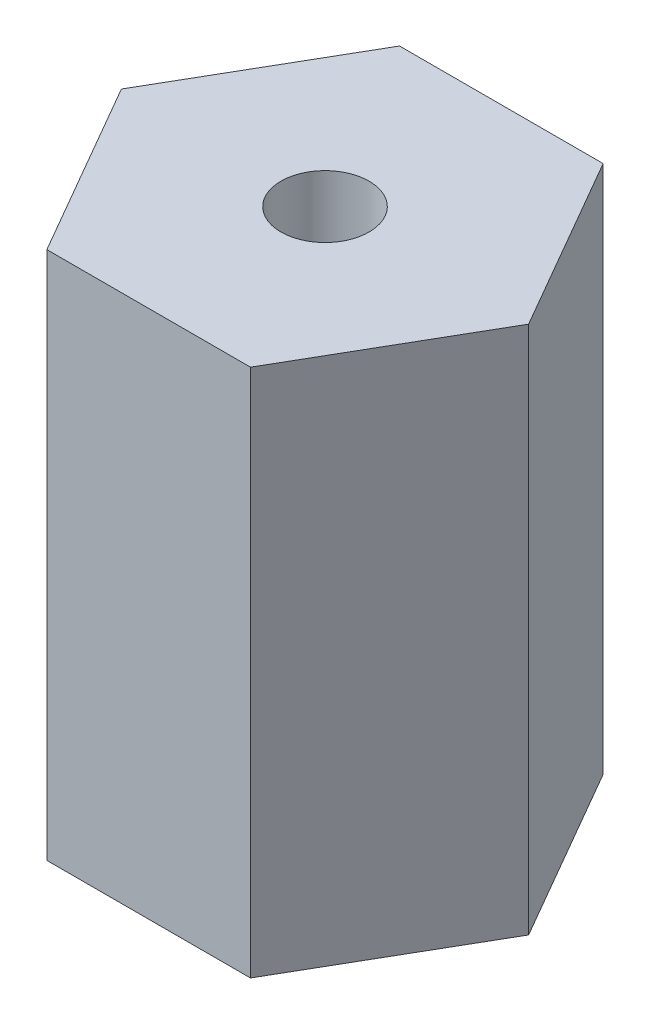
ISO-10303-21;
HEADER;
FILE_DESCRIPTION(('STEP AP214'),'2;1');
FILE_NAME('part.step','',(''),(''),'','','');
FILE_SCHEMA(('AUTOMOTIVE_DESIGN { 1 0 10303 214 1 1 1 1 }'));
ENDSEC;
DATA;
#1=APPLICATION_CONTEXT('core data for automotive mechanical design processes');
#2=APPLICATION_PROTOCOL_DEFINITION('international standard','automotive_design',2000,#1);
#3=PRODUCT_CONTEXT('',#1,'mechanical');
#4=PRODUCT('Part','Part','',(#3));
#5=PRODUCT_RELATED_PRODUCT_CATEGORY('part','',(#4));
#6=PRODUCT_DEFINITION_FORMATION('','',#4);
#7=PRODUCT_DEFINITION_CONTEXT('part definition',#1,'design');
#8=PRODUCT_DEFINITION('design','',#6,#7);
#9=PRODUCT_DEFINITION_SHAPE('','',#8);
#10=(LENGTH_UNIT() NAMED_UNIT(*) SI_UNIT(.MILLI.,.METRE.));
#11=(NAMED_UNIT(*) PLANE_ANGLE_UNIT() SI_UNIT($,.RADIAN.));
#12=(NAMED_UNIT(*) SI_UNIT($,.STERADIAN.) SOLID_ANGLE_UNIT());
#13=UNCERTAINTY_MEASURE_WITH_UNIT(LENGTH_MEASURE(1.E-05),#10,'distance_accuracy_value','');
#14=(GEOMETRIC_REPRESENTATION_CONTEXT(3) GLOBAL_UNCERTAINTY_ASSIGNED_CONTEXT((#13)) GLOBAL_UNIT_ASSIGNED_CONTEXT((#10,
#11,#12)) REPRESENTATION_CONTEXT('',''));
#15=CARTESIAN_POINT('',(0.,0.,0.));
#16=DIRECTION('',(0.,0.,1.));
#17=DIRECTION('',(1.,0.,0.));
#18=AXIS2_PLACEMENT_3D('',#15,#16,#17);
#19=CARTESIAN_POINT('',(0.,30.,0.));
#20=DIRECTION('',(0.,1.,0.));
#21=DIRECTION('',(0.,0.,1.));
#22=AXIS2_PLACEMENT_3D('',#19,#20,#21);
#23=PLANE('',#22);
#24=DIRECTION('',(0.5,0.,-0.866025403784439));
#25=VECTOR('',#24,1.);
#26=CARTESIAN_POINT('',(-9.13675134594814,30.,4.17468245269454));
#27=LINE('',#26,#25);
#28=CARTESIAN_POINT('',(-9.13675134594814,30.,4.17468245269454));
#29=VERTEX_POINT('',#28);
#30=CARTESIAN_POINT('',(-3.36324865405187,30.,-5.82531754730549));
#31=VERTEX_POINT('',#30);
#32=EDGE_CURVE('E129',#29,#31,#27,.T.);
#33=ORIENTED_EDGE('',*,*,#32,.T.);
#34=DIRECTION('',(-0.5,0.,-0.866025403784439));
#35=VECTOR('',#34,1.);
#36=CARTESIAN_POINT('',(-3.36324865405187,30.,-5.82531754730549));
#37=LINE('',#36,#35);
#38=CARTESIAN_POINT('',(-9.13675134594814,30.,-15.8253175473055));
#39=VERTEX_POINT('',#38);
#40=EDGE_CURVE('E87',#31,#39,#37,.T.);
#41=ORIENTED_EDGE('',*,*,#40,.T.);
#42=DIRECTION('',(-1.,0.,0.));
#43=VECTOR('',#42,1.);
#44=CARTESIAN_POINT('',(-9.13675134594814,30.,-15.8253175473055));
#45=LINE('',#44,#43);
#46=CARTESIAN_POINT('',(-20.6837567297407,30.,-15.8253175473055));
#47=VERTEX_POINT('',#46);
#48=EDGE_CURVE('E100',#39,#47,#45,.T.);
#49=ORIENTED_EDGE('',*,*,#48,.T.);
#50=DIRECTION('',(-0.5,0.,0.866025403784439));
#51=VECTOR('',#50,1.);
#52=CARTESIAN_POINT('',(-20.6837567297407,30.,-15.8253175473055));
#53=LINE('',#52,#51);
#54=CARTESIAN_POINT('',(-26.4572594216369,30.,-5.82531754730548));
#55=VERTEX_POINT('',#54);
#56=EDGE_CURVE('E94',#47,#55,#53,.T.);
#57=ORIENTED_EDGE('',*,*,#56,.T.);
#58=DIRECTION('',(0.5,0.,0.866025403784439));
#59=VECTOR('',#58,1.);
#60=CARTESIAN_POINT('',(-26.4572594216369,30.,-5.82531754730548));
#61=LINE('',#60,#59);
#62=CARTESIAN_POINT('',(-20.6837567297407,30.,4.17468245269454));
#63=VERTEX_POINT('',#62);
#64=EDGE_CURVE('E98',#55,#63,#61,.T.);
#65=ORIENTED_EDGE('',*,*,#64,.T.);
#66=DIRECTION('',(1.,0.,0.));
#67=VECTOR('',#66,1.);
#68=CARTESIAN_POINT('',(-20.6837567297407,30.,4.17468245269454));
#69=LINE('',#68,#67);
#70=EDGE_CURVE('E50',#63,#29,#69,.T.);
#71=ORIENTED_EDGE('',*,*,#70,.T.);
#72=EDGE_LOOP('',(#33,#41,#49,#57,#65,#71));
#73=FACE_BOUND('',#72,.T.);
#74=CARTESIAN_POINT('',(-14.9102540378444,30.,-5.82531754730548));
#75=DIRECTION('',(0.,1.,0.));
#76=DIRECTION('',(0.,0.,1.));
#77=AXIS2_PLACEMENT_3D('',#74,#75,#76);
#78=CIRCLE('',#77,2.5);
#79=CARTESIAN_POINT('',(-14.9102540378444,30.,-3.32531754730548));
#80=VERTEX_POINT('',#79);
#81=EDGE_CURVE('E122',#80,#80,#78,.T.);
#82=ORIENTED_EDGE('',*,*,#81,.F.);
#83=EDGE_LOOP('',(#82));
#84=FACE_BOUND('',#83,.T.);
#85=ADVANCED_FACE('F33',(#73,#84),#23,.T.);
#86=CARTESIAN_POINT('',(0.,0.,0.));
#87=DIRECTION('',(0.,1.,0.));
#88=DIRECTION('',(0.,0.,1.));
#89=AXIS2_PLACEMENT_3D('',#86,#87,#88);
#90=PLANE('',#89);
#91=DIRECTION('',(0.5,0.,-0.866025403784439));
#92=VECTOR('',#91,1.);
#93=CARTESIAN_POINT('',(-9.13675134594814,0.,4.17468245269454));
#94=LINE('',#93,#92);
#95=CARTESIAN_POINT('',(-9.13675134594814,0.,4.17468245269454));
#96=VERTEX_POINT('',#95);
#97=CARTESIAN_POINT('',(-3.36324865405187,0.,-5.82531754730549));
#98=VERTEX_POINT('',#97);
#99=EDGE_CURVE('E118',#96,#98,#94,.T.);
#100=ORIENTED_EDGE('',*,*,#99,.F.);
#101=DIRECTION('',(1.,0.,0.));
#102=VECTOR('',#101,1.);
#103=CARTESIAN_POINT('',(-20.6837567297407,0.,4.17468245269454));
#104=LINE('',#103,#102);
#105=CARTESIAN_POINT('',(-20.6837567297407,0.,4.17468245269454));
#106=VERTEX_POINT('',#105);
#107=EDGE_CURVE('E79',#106,#96,#104,.T.);
#108=ORIENTED_EDGE('',*,*,#107,.F.);
#109=DIRECTION('',(0.5,0.,0.866025403784439));
#110=VECTOR('',#109,1.);
#111=CARTESIAN_POINT('',(-26.4572594216369,0.,-5.82531754730548));
#112=LINE('',#111,#110);
#113=CARTESIAN_POINT('',(-26.4572594216369,0.,-5.82531754730548));
#114=VERTEX_POINT('',#113);
#115=EDGE_CURVE('E73',#114,#106,#112,.T.);
#116=ORIENTED_EDGE('',*,*,#115,.F.);
#117=DIRECTION('',(-0.5,0.,0.866025403784439));
#118=VECTOR('',#117,1.);
#119=CARTESIAN_POINT('',(-20.6837567297407,0.,-15.8253175473055));
#120=LINE('',#119,#118);
#121=CARTESIAN_POINT('',(-20.6837567297407,0.,-15.8253175473055));
#122=VERTEX_POINT('',#121);
#123=EDGE_CURVE('E108',#122,#114,#120,.T.);
#124=ORIENTED_EDGE('',*,*,#123,.F.);
#125=DIRECTION('',(-1.,0.,0.));
#126=VECTOR('',#125,1.);
#127=CARTESIAN_POINT('',(-9.13675134594814,0.,-15.8253175473055));
#128=LINE('',#127,#126);
#129=CARTESIAN_POINT('',(-9.13675134594814,0.,-15.8253175473055));
#130=VERTEX_POINT('',#129);
#131=EDGE_CURVE('E124',#130,#122,#128,.T.);
#132=ORIENTED_EDGE('',*,*,#131,.F.);
#133=DIRECTION('',(-0.5,0.,-0.866025403784439));
#134=VECTOR('',#133,1.);
#135=CARTESIAN_POINT('',(-3.36324865405187,0.,-5.82531754730549));
#136=LINE('',#135,#134);
#137=EDGE_CURVE('E121',#98,#130,#136,.T.);
#138=ORIENTED_EDGE('',*,*,#137,.F.);
#139=EDGE_LOOP('',(#100,#108,#116,#124,#132,#138));
#140=FACE_BOUND('',#139,.T.);
#141=CARTESIAN_POINT('',(-14.9102540378444,0.,-5.82531754730548));
#142=DIRECTION('',(0.,1.,0.));
#143=DIRECTION('',(0.,0.,1.));
#144=AXIS2_PLACEMENT_3D('',#141,#142,#143);
#145=CIRCLE('',#144,2.5);
#146=CARTESIAN_POINT('',(-14.9102540378444,0.,-3.32531754730548));
#147=VERTEX_POINT('',#146);
#148=EDGE_CURVE('E222',#147,#147,#145,.T.);
#149=ORIENTED_EDGE('',*,*,#148,.T.);
#150=EDGE_LOOP('',(#149));
#151=FACE_BOUND('',#150,.T.);
#152=ADVANCED_FACE('F138',(#140,#151),#90,.F.);
#153=CARTESIAN_POINT('',(-9.13675134594814,30.,4.17468245269454));
#154=DIRECTION('',(-0.866025403784439,0.,-0.5));
#155=DIRECTION('',(-0.5,0.,0.866025403784439));
#156=AXIS2_PLACEMENT_3D('',#153,#154,#155);
#157=PLANE('',#156);
#158=ORIENTED_EDGE('',*,*,#99,.T.);
#159=DIRECTION('',(0.,-1.,0.));
#160=VECTOR('',#159,1.);
#161=CARTESIAN_POINT('',(-3.36324865405187,30.,-5.82531754730549));
#162=LINE('',#161,#160);
#163=EDGE_CURVE('E11',#31,#98,#162,.T.);
#164=ORIENTED_EDGE('',*,*,#163,.F.);
#165=ORIENTED_EDGE('',*,*,#32,.F.);
#166=DIRECTION('',(0.,-1.,0.));
#167=VECTOR('',#166,1.);
#168=CARTESIAN_POINT('',(-9.13675134594814,30.,4.17468245269454));
#169=LINE('',#168,#167);
#170=EDGE_CURVE('E114',#29,#96,#169,.T.);
#171=ORIENTED_EDGE('',*,*,#170,.T.);
#172=EDGE_LOOP('',(#158,#164,#165,#171));
#173=FACE_BOUND('',#172,.T.);
#174=ADVANCED_FACE('F35',(#173),#157,.F.);
#175=CARTESIAN_POINT('',(-3.36324865405187,30.,-5.82531754730549));
#176=DIRECTION('',(-0.866025403784439,0.,0.5));
#177=DIRECTION('',(0.5,0.,0.866025403784439));
#178=AXIS2_PLACEMENT_3D('',#175,#176,#177);
#179=PLANE('',#178);
#180=ORIENTED_EDGE('',*,*,#137,.T.);
#181=DIRECTION('',(0.,-1.,0.));
#182=VECTOR('',#181,1.);
#183=CARTESIAN_POINT('',(-9.13675134594814,30.,-15.8253175473055));
#184=LINE('',#183,#182);
#185=EDGE_CURVE('E42',#39,#130,#184,.T.);
#186=ORIENTED_EDGE('',*,*,#185,.F.);
#187=ORIENTED_EDGE('',*,*,#40,.F.);
#188=ORIENTED_EDGE('',*,*,#163,.T.);
#189=EDGE_LOOP('',(#180,#186,#187,#188));
#190=FACE_BOUND('',#189,.T.);
#191=ADVANCED_FACE('F163',(#190),#179,.F.);
#192=CARTESIAN_POINT('',(-9.13675134594814,30.,-15.8253175473055));
#193=DIRECTION('',(0.,0.,1.));
#194=DIRECTION('',(1.,0.,0.));
#195=AXIS2_PLACEMENT_3D('',#192,#193,#194);
#196=PLANE('',#195);
#197=ORIENTED_EDGE('',*,*,#131,.T.);
#198=DIRECTION('',(0.,-1.,0.));
#199=VECTOR('',#198,1.);
#200=CARTESIAN_POINT('',(-20.6837567297407,30.,-15.8253175473055));
#201=LINE('',#200,#199);
#202=EDGE_CURVE('E109',#47,#122,#201,.T.);
#203=ORIENTED_EDGE('',*,*,#202,.F.);
#204=ORIENTED_EDGE('',*,*,#48,.F.);
#205=ORIENTED_EDGE('',*,*,#185,.T.);
#206=EDGE_LOOP('',(#197,#203,#204,#205));
#207=FACE_BOUND('',#206,.T.);
#208=ADVANCED_FACE('F135',(#207),#196,.F.);
#209=CARTESIAN_POINT('',(-20.6837567297407,30.,-15.8253175473055));
#210=DIRECTION('',(0.866025403784439,0.,0.5));
#211=DIRECTION('',(0.5,0.,-0.866025403784439));
#212=AXIS2_PLACEMENT_3D('',#209,#210,#211);
#213=PLANE('',#212);
#214=ORIENTED_EDGE('',*,*,#123,.T.);
#215=DIRECTION('',(0.,-1.,0.));
#216=VECTOR('',#215,1.);
#217=CARTESIAN_POINT('',(-26.4572594216369,30.,-5.82531754730548));
#218=LINE('',#217,#216);
#219=EDGE_CURVE('E105',#55,#114,#218,.T.);
#220=ORIENTED_EDGE('',*,*,#219,.F.);
#221=ORIENTED_EDGE('',*,*,#56,.F.);
#222=ORIENTED_EDGE('',*,*,#202,.T.);
#223=EDGE_LOOP('',(#214,#220,#221,#222));
#224=FACE_BOUND('',#223,.T.);
#225=ADVANCED_FACE('F106',(#224),#213,.F.);
#226=CARTESIAN_POINT('',(-26.4572594216369,30.,-5.82531754730548));
#227=DIRECTION('',(0.866025403784439,0.,-0.5));
#228=DIRECTION('',(-0.5,0.,-0.866025403784439));
#229=AXIS2_PLACEMENT_3D('',#226,#227,#228);
#230=PLANE('',#229);
#231=ORIENTED_EDGE('',*,*,#115,.T.);
#232=DIRECTION('',(0.,-1.,0.));
#233=VECTOR('',#232,1.);
#234=CARTESIAN_POINT('',(-20.6837567297407,30.,4.17468245269454));
#235=LINE('',#234,#233);
#236=EDGE_CURVE('E110',#63,#106,#235,.T.);
#237=ORIENTED_EDGE('',*,*,#236,.F.);
#238=ORIENTED_EDGE('',*,*,#64,.F.);
#239=ORIENTED_EDGE('',*,*,#219,.T.);
#240=EDGE_LOOP('',(#231,#237,#238,#239));
#241=FACE_BOUND('',#240,.T.);
#242=ADVANCED_FACE('F112',(#241),#230,.F.);
#243=CARTESIAN_POINT('',(-20.6837567297407,30.,4.17468245269454));
#244=DIRECTION('',(0.,0.,-1.));
#245=DIRECTION('',(-1.,0.,0.));
#246=AXIS2_PLACEMENT_3D('',#243,#244,#245);
#247=PLANE('',#246);
#248=ORIENTED_EDGE('',*,*,#107,.T.);
#249=ORIENTED_EDGE('',*,*,#170,.F.);
#250=ORIENTED_EDGE('',*,*,#70,.F.);
#251=ORIENTED_EDGE('',*,*,#236,.T.);
#252=EDGE_LOOP('',(#248,#249,#250,#251));
#253=FACE_BOUND('',#252,.T.);
#254=ADVANCED_FACE('F143',(#253),#247,.F.);
#255=CARTESIAN_POINT('',(-14.9102540378444,30.,-5.82531754730548));
#256=DIRECTION('',(0.,-1.,0.));
#257=DIRECTION('',(0.,0.,-1.));
#258=AXIS2_PLACEMENT_3D('',#255,#256,#257);
#259=CYLINDRICAL_SURFACE('',#258,2.5);
#260=ORIENTED_EDGE('',*,*,#81,.T.);
#261=EDGE_LOOP('',(#260));
#262=FACE_BOUND('',#261,.T.);
#263=ORIENTED_EDGE('',*,*,#148,.F.);
#264=EDGE_LOOP('',(#263));
#265=FACE_BOUND('',#264,.T.);
#266=ADVANCED_FACE('F145',(#262,#265),#259,.F.);
#267=CLOSED_SHELL('',(#85,#152,#174,#191,#208,#225,#242,#254,#266));
#268=MANIFOLD_SOLID_BREP('B2',#267);
#269=ADVANCED_BREP_SHAPE_REPRESENTATION('',(#18,#268),#14);
#270=SHAPE_DEFINITION_REPRESENTATION(#9,#269);
ENDSEC;
END-ISO-10303-21;
